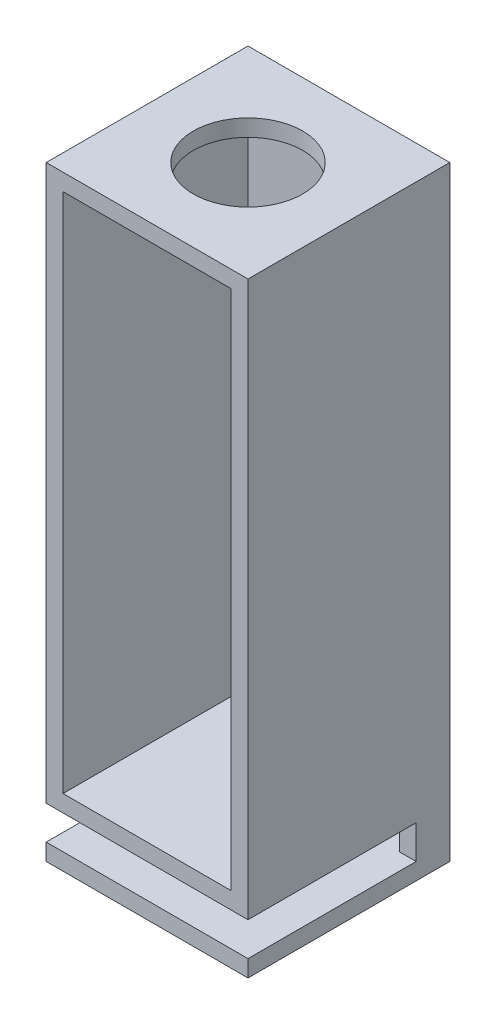
ISO-10303-21;
HEADER;
FILE_DESCRIPTION(('STEP AP214'),'2;1');
FILE_NAME('part.step','',(''),(''),'','','');
FILE_SCHEMA(('AUTOMOTIVE_DESIGN { 1 0 10303 214 1 1 1 1 }'));
ENDSEC;
DATA;
#1=APPLICATION_CONTEXT('core data for automotive mechanical design processes');
#2=APPLICATION_PROTOCOL_DEFINITION('international standard','automotive_design',2000,#1);
#3=PRODUCT_CONTEXT('',#1,'mechanical');
#4=PRODUCT('Part','Part','',(#3));
#5=PRODUCT_RELATED_PRODUCT_CATEGORY('part','',(#4));
#6=PRODUCT_DEFINITION_FORMATION('','',#4);
#7=PRODUCT_DEFINITION_CONTEXT('part definition',#1,'design');
#8=PRODUCT_DEFINITION('design','',#6,#7);
#9=PRODUCT_DEFINITION_SHAPE('','',#8);
#10=(LENGTH_UNIT() NAMED_UNIT(*) SI_UNIT(.MILLI.,.METRE.));
#11=(NAMED_UNIT(*) PLANE_ANGLE_UNIT() SI_UNIT($,.RADIAN.));
#12=(NAMED_UNIT(*) SI_UNIT($,.STERADIAN.) SOLID_ANGLE_UNIT());
#13=UNCERTAINTY_MEASURE_WITH_UNIT(LENGTH_MEASURE(1.E-05),#10,'distance_accuracy_value','');
#14=(GEOMETRIC_REPRESENTATION_CONTEXT(3) GLOBAL_UNCERTAINTY_ASSIGNED_CONTEXT((#13)) GLOBAL_UNIT_ASSIGNED_CONTEXT((#10,
#11,#12)) REPRESENTATION_CONTEXT('',''));
#15=CARTESIAN_POINT('',(0.,0.,0.));
#16=DIRECTION('',(0.,0.,1.));
#17=DIRECTION('',(1.,0.,0.));
#18=AXIS2_PLACEMENT_3D('',#15,#16,#17);
#19=CARTESIAN_POINT('',(5.,36.,-6.));
#20=DIRECTION('',(-1.,0.,0.));
#21=DIRECTION('',(0.,0.,1.));
#22=AXIS2_PLACEMENT_3D('',#19,#20,#21);
#23=PLANE('',#22);
#24=DIRECTION('',(0.,0.,1.));
#25=VECTOR('',#24,1.);
#26=CARTESIAN_POINT('',(5.,4.,-15.0498756211209));
#27=LINE('',#26,#25);
#28=CARTESIAN_POINT('',(5.,4.,-5.));
#29=VERTEX_POINT('',#28);
#30=CARTESIAN_POINT('',(5.,4.,6.));
#31=VERTEX_POINT('',#30);
#32=EDGE_CURVE('E158',#29,#31,#27,.T.);
#33=ORIENTED_EDGE('',*,*,#32,.T.);
#34=DIRECTION('',(0.,-1.,0.));
#35=VECTOR('',#34,1.);
#36=CARTESIAN_POINT('',(5.,36.,6.));
#37=LINE('',#36,#35);
#38=CARTESIAN_POINT('',(5.,35.,6.));
#39=VERTEX_POINT('',#38);
#40=EDGE_CURVE('E172',#39,#31,#37,.T.);
#41=ORIENTED_EDGE('',*,*,#40,.F.);
#42=DIRECTION('',(0.,0.,-1.));
#43=VECTOR('',#42,1.);
#44=CARTESIAN_POINT('',(5.,35.,-6.));
#45=LINE('',#44,#43);
#46=CARTESIAN_POINT('',(5.,35.,-5.));
#47=VERTEX_POINT('',#46);
#48=EDGE_CURVE('E197',#39,#47,#45,.T.);
#49=ORIENTED_EDGE('',*,*,#48,.T.);
#50=DIRECTION('',(0.,-1.,0.));
#51=VECTOR('',#50,1.);
#52=CARTESIAN_POINT('',(5.,36.,-5.));
#53=LINE('',#52,#51);
#54=EDGE_CURVE('E175',#47,#29,#53,.T.);
#55=ORIENTED_EDGE('',*,*,#54,.T.);
#56=EDGE_LOOP('',(#33,#41,#49,#55));
#57=FACE_BOUND('',#56,.T.);
#58=ADVANCED_FACE('F39',(#57),#23,.T.);
#59=CARTESIAN_POINT('',(-6.,36.,-5.));
#60=DIRECTION('',(0.,0.,1.));
#61=DIRECTION('',(1.,0.,0.));
#62=AXIS2_PLACEMENT_3D('',#59,#60,#61);
#63=PLANE('',#62);
#64=DIRECTION('',(1.,0.,0.));
#65=VECTOR('',#64,1.);
#66=CARTESIAN_POINT('',(-5.,4.,-5.));
#67=LINE('',#66,#65);
#68=CARTESIAN_POINT('',(-5.,4.,-5.));
#69=VERTEX_POINT('',#68);
#70=EDGE_CURVE('E300',#69,#29,#67,.T.);
#71=ORIENTED_EDGE('',*,*,#70,.T.);
#72=ORIENTED_EDGE('',*,*,#54,.F.);
#73=DIRECTION('',(-1.,0.,0.));
#74=VECTOR('',#73,1.);
#75=CARTESIAN_POINT('',(-6.,35.,-5.));
#76=LINE('',#75,#74);
#77=CARTESIAN_POINT('',(-5.,35.,-5.));
#78=VERTEX_POINT('',#77);
#79=EDGE_CURVE('E277',#47,#78,#76,.T.);
#80=ORIENTED_EDGE('',*,*,#79,.T.);
#81=DIRECTION('',(0.,-1.,0.));
#82=VECTOR('',#81,1.);
#83=CARTESIAN_POINT('',(-5.,36.,-5.));
#84=LINE('',#83,#82);
#85=EDGE_CURVE('E264',#78,#69,#84,.T.);
#86=ORIENTED_EDGE('',*,*,#85,.T.);
#87=EDGE_LOOP('',(#71,#72,#80,#86));
#88=FACE_BOUND('',#87,.T.);
#89=ADVANCED_FACE('F298',(#88),#63,.T.);
#90=CARTESIAN_POINT('',(-5.,36.,-6.));
#91=DIRECTION('',(1.,0.,0.));
#92=DIRECTION('',(0.,0.,-1.));
#93=AXIS2_PLACEMENT_3D('',#90,#91,#92);
#94=PLANE('',#93);
#95=DIRECTION('',(0.,0.,1.));
#96=VECTOR('',#95,1.);
#97=CARTESIAN_POINT('',(-5.,4.,-15.0498756211209));
#98=LINE('',#97,#96);
#99=CARTESIAN_POINT('',(-5.,4.,6.));
#100=VERTEX_POINT('',#99);
#101=EDGE_CURVE('E161',#69,#100,#98,.T.);
#102=ORIENTED_EDGE('',*,*,#101,.F.);
#103=ORIENTED_EDGE('',*,*,#85,.F.);
#104=DIRECTION('',(0.,0.,1.));
#105=VECTOR('',#104,1.);
#106=CARTESIAN_POINT('',(-5.,35.,-6.));
#107=LINE('',#106,#105);
#108=CARTESIAN_POINT('',(-5.,35.,6.));
#109=VERTEX_POINT('',#108);
#110=EDGE_CURVE('E189',#78,#109,#107,.T.);
#111=ORIENTED_EDGE('',*,*,#110,.T.);
#112=DIRECTION('',(0.,-1.,0.));
#113=VECTOR('',#112,1.);
#114=CARTESIAN_POINT('',(-5.,36.,6.));
#115=LINE('',#114,#113);
#116=EDGE_CURVE('E183',#109,#100,#115,.T.);
#117=ORIENTED_EDGE('',*,*,#116,.T.);
#118=EDGE_LOOP('',(#102,#103,#111,#117));
#119=FACE_BOUND('',#118,.T.);
#120=ADVANCED_FACE('F371',(#119),#94,.T.);
#121=CARTESIAN_POINT('',(-6.,36.,6.));
#122=DIRECTION('',(0.,0.,-1.));
#123=DIRECTION('',(-1.,0.,0.));
#124=AXIS2_PLACEMENT_3D('',#121,#122,#123);
#125=PLANE('',#124);
#126=ORIENTED_EDGE('',*,*,#40,.T.);
#127=DIRECTION('',(-1.,0.,0.));
#128=VECTOR('',#127,1.);
#129=CARTESIAN_POINT('',(-5.,4.,6.));
#130=LINE('',#129,#128);
#131=EDGE_CURVE('E155',#31,#100,#130,.T.);
#132=ORIENTED_EDGE('',*,*,#131,.T.);
#133=ORIENTED_EDGE('',*,*,#116,.F.);
#134=DIRECTION('',(1.,0.,0.));
#135=VECTOR('',#134,1.);
#136=CARTESIAN_POINT('',(-6.,35.,6.));
#137=LINE('',#136,#135);
#138=EDGE_CURVE('E181',#109,#39,#137,.T.);
#139=ORIENTED_EDGE('',*,*,#138,.T.);
#140=EDGE_LOOP('',(#126,#132,#133,#139));
#141=FACE_BOUND('',#140,.T.);
#142=DIRECTION('',(0.,-1.,0.));
#143=VECTOR('',#142,1.);
#144=CARTESIAN_POINT('',(-6.,36.,6.));
#145=LINE('',#144,#143);
#146=CARTESIAN_POINT('',(-6.,36.,6.));
#147=VERTEX_POINT('',#146);
#148=CARTESIAN_POINT('',(-6.,3.,6.));
#149=VERTEX_POINT('',#148);
#150=EDGE_CURVE('E233',#147,#149,#145,.T.);
#151=ORIENTED_EDGE('',*,*,#150,.T.);
#152=DIRECTION('',(-1.,0.,0.));
#153=VECTOR('',#152,1.);
#154=CARTESIAN_POINT('',(-6.77267637178051,3.,6.));
#155=LINE('',#154,#153);
#156=CARTESIAN_POINT('',(5.99999999999999,3.,6.));
#157=VERTEX_POINT('',#156);
#158=EDGE_CURVE('E306',#157,#149,#155,.T.);
#159=ORIENTED_EDGE('',*,*,#158,.F.);
#160=DIRECTION('',(0.,-1.,0.));
#161=VECTOR('',#160,1.);
#162=CARTESIAN_POINT('',(6.,36.,6.));
#163=LINE('',#162,#161);
#164=CARTESIAN_POINT('',(6.,36.,6.));
#165=VERTEX_POINT('',#164);
#166=EDGE_CURVE('E228',#165,#157,#163,.T.);
#167=ORIENTED_EDGE('',*,*,#166,.F.);
#168=DIRECTION('',(1.,0.,0.));
#169=VECTOR('',#168,1.);
#170=CARTESIAN_POINT('',(-6.,36.,6.));
#171=LINE('',#170,#169);
#172=EDGE_CURVE('E210',#147,#165,#171,.T.);
#173=ORIENTED_EDGE('',*,*,#172,.F.);
#174=EDGE_LOOP('',(#151,#159,#167,#173));
#175=FACE_BOUND('',#174,.T.);
#176=ADVANCED_FACE('F179',(#141,#175),#125,.F.);
#177=CARTESIAN_POINT('',(5.99999999999999,1.,6.));
#178=VERTEX_POINT('',#177);
#179=CARTESIAN_POINT('',(6.,0.,6.));
#180=VERTEX_POINT('',#179);
#181=EDGE_CURVE('E213',#178,#180,#163,.T.);
#182=ORIENTED_EDGE('',*,*,#181,.F.);
#183=DIRECTION('',(1.,0.,0.));
#184=VECTOR('',#183,1.);
#185=CARTESIAN_POINT('',(-6.,1.,6.));
#186=LINE('',#185,#184);
#187=CARTESIAN_POINT('',(-6.,1.,6.));
#188=VERTEX_POINT('',#187);
#189=EDGE_CURVE('E194',#188,#178,#186,.T.);
#190=ORIENTED_EDGE('',*,*,#189,.F.);
#191=CARTESIAN_POINT('',(-6.,0.,6.));
#192=VERTEX_POINT('',#191);
#193=EDGE_CURVE('E232',#188,#192,#145,.T.);
#194=ORIENTED_EDGE('',*,*,#193,.T.);
#195=DIRECTION('',(1.,0.,0.));
#196=VECTOR('',#195,1.);
#197=CARTESIAN_POINT('',(-6.,0.,6.));
#198=LINE('',#197,#196);
#199=EDGE_CURVE('E204',#192,#180,#198,.T.);
#200=ORIENTED_EDGE('',*,*,#199,.T.);
#201=EDGE_LOOP('',(#182,#190,#194,#200));
#202=FACE_BOUND('',#201,.T.);
#203=ADVANCED_FACE('F254',(#202),#125,.F.);
#204=CARTESIAN_POINT('',(6.,36.,-6.));
#205=DIRECTION('',(-1.,0.,0.));
#206=DIRECTION('',(0.,0.,1.));
#207=AXIS2_PLACEMENT_3D('',#204,#205,#206);
#208=PLANE('',#207);
#209=ORIENTED_EDGE('',*,*,#166,.T.);
#210=DIRECTION('',(0.,0.,-1.));
#211=VECTOR('',#210,1.);
#212=CARTESIAN_POINT('',(6.,3.,-6.));
#213=LINE('',#212,#211);
#214=CARTESIAN_POINT('',(5.99999999999999,3.,-4.));
#215=VERTEX_POINT('',#214);
#216=EDGE_CURVE('E348',#157,#215,#213,.T.);
#217=ORIENTED_EDGE('',*,*,#216,.T.);
#218=DIRECTION('',(0.,-1.,0.));
#219=VECTOR('',#218,1.);
#220=CARTESIAN_POINT('',(6.,36.,-4.));
#221=LINE('',#220,#219);
#222=CARTESIAN_POINT('',(5.99999999999999,1.,-4.));
#223=VERTEX_POINT('',#222);
#224=EDGE_CURVE('E334',#215,#223,#221,.T.);
#225=ORIENTED_EDGE('',*,*,#224,.T.);
#226=DIRECTION('',(0.,0.,1.));
#227=VECTOR('',#226,1.);
#228=CARTESIAN_POINT('',(6.,1.,-6.));
#229=LINE('',#228,#227);
#230=EDGE_CURVE('E341',#223,#178,#229,.T.);
#231=ORIENTED_EDGE('',*,*,#230,.T.);
#232=ORIENTED_EDGE('',*,*,#181,.T.);
#233=DIRECTION('',(0.,0.,-1.));
#234=VECTOR('',#233,1.);
#235=CARTESIAN_POINT('',(6.,0.,-6.));
#236=LINE('',#235,#234);
#237=CARTESIAN_POINT('',(6.,0.,-6.));
#238=VERTEX_POINT('',#237);
#239=EDGE_CURVE('E214',#180,#238,#236,.T.);
#240=ORIENTED_EDGE('',*,*,#239,.T.);
#241=DIRECTION('',(0.,-1.,0.));
#242=VECTOR('',#241,1.);
#243=CARTESIAN_POINT('',(6.,36.,-6.));
#244=LINE('',#243,#242);
#245=CARTESIAN_POINT('',(6.,36.,-6.));
#246=VERTEX_POINT('',#245);
#247=EDGE_CURVE('E11',#246,#238,#244,.T.);
#248=ORIENTED_EDGE('',*,*,#247,.F.);
#249=DIRECTION('',(0.,0.,-1.));
#250=VECTOR('',#249,1.);
#251=CARTESIAN_POINT('',(6.,36.,-6.));
#252=LINE('',#251,#250);
#253=EDGE_CURVE('E199',#165,#246,#252,.T.);
#254=ORIENTED_EDGE('',*,*,#253,.F.);
#255=EDGE_LOOP('',(#209,#217,#225,#231,#232,#240,#248,#254));
#256=FACE_BOUND('',#255,.T.);
#257=ADVANCED_FACE('F41',(#256),#208,.F.);
#258=CARTESIAN_POINT('',(-6.,36.,-6.));
#259=DIRECTION('',(0.,0.,1.));
#260=DIRECTION('',(1.,0.,0.));
#261=AXIS2_PLACEMENT_3D('',#258,#259,#260);
#262=PLANE('',#261);
#263=DIRECTION('',(-1.,0.,0.));
#264=VECTOR('',#263,1.);
#265=CARTESIAN_POINT('',(-6.,0.,-6.));
#266=LINE('',#265,#264);
#267=CARTESIAN_POINT('',(-6.,0.,-6.));
#268=VERTEX_POINT('',#267);
#269=EDGE_CURVE('E218',#238,#268,#266,.T.);
#270=ORIENTED_EDGE('',*,*,#269,.T.);
#271=DIRECTION('',(0.,-1.,0.));
#272=VECTOR('',#271,1.);
#273=CARTESIAN_POINT('',(-6.,36.,-6.));
#274=LINE('',#273,#272);
#275=CARTESIAN_POINT('',(-6.,36.,-6.));
#276=VERTEX_POINT('',#275);
#277=EDGE_CURVE('E49',#276,#268,#274,.T.);
#278=ORIENTED_EDGE('',*,*,#277,.F.);
#279=DIRECTION('',(-1.,0.,0.));
#280=VECTOR('',#279,1.);
#281=CARTESIAN_POINT('',(-6.,36.,-6.));
#282=LINE('',#281,#280);
#283=EDGE_CURVE('E203',#246,#276,#282,.T.);
#284=ORIENTED_EDGE('',*,*,#283,.F.);
#285=ORIENTED_EDGE('',*,*,#247,.T.);
#286=EDGE_LOOP('',(#270,#278,#284,#285));
#287=FACE_BOUND('',#286,.T.);
#288=ADVANCED_FACE('F399',(#287),#262,.F.);
#289=CARTESIAN_POINT('',(-6.,36.,-6.));
#290=DIRECTION('',(1.,0.,0.));
#291=DIRECTION('',(0.,0.,-1.));
#292=AXIS2_PLACEMENT_3D('',#289,#290,#291);
#293=PLANE('',#292);
#294=DIRECTION('',(0.,1.,0.));
#295=VECTOR('',#294,1.);
#296=CARTESIAN_POINT('',(-6.,36.,-4.));
#297=LINE('',#296,#295);
#298=CARTESIAN_POINT('',(-6.,1.,-4.));
#299=VERTEX_POINT('',#298);
#300=CARTESIAN_POINT('',(-6.,3.,-4.));
#301=VERTEX_POINT('',#300);
#302=EDGE_CURVE('E331',#299,#301,#297,.T.);
#303=ORIENTED_EDGE('',*,*,#302,.T.);
#304=DIRECTION('',(0.,0.,1.));
#305=VECTOR('',#304,1.);
#306=CARTESIAN_POINT('',(-6.,3.,-6.));
#307=LINE('',#306,#305);
#308=EDGE_CURVE('E345',#301,#149,#307,.T.);
#309=ORIENTED_EDGE('',*,*,#308,.T.);
#310=ORIENTED_EDGE('',*,*,#150,.F.);
#311=DIRECTION('',(0.,0.,1.));
#312=VECTOR('',#311,1.);
#313=CARTESIAN_POINT('',(-6.,36.,-6.));
#314=LINE('',#313,#312);
#315=EDGE_CURVE('E207',#276,#147,#314,.T.);
#316=ORIENTED_EDGE('',*,*,#315,.F.);
#317=ORIENTED_EDGE('',*,*,#277,.T.);
#318=DIRECTION('',(0.,0.,1.));
#319=VECTOR('',#318,1.);
#320=CARTESIAN_POINT('',(-6.,0.,-6.));
#321=LINE('',#320,#319);
#322=EDGE_CURVE('E221',#268,#192,#321,.T.);
#323=ORIENTED_EDGE('',*,*,#322,.T.);
#324=ORIENTED_EDGE('',*,*,#193,.F.);
#325=DIRECTION('',(0.,0.,-1.));
#326=VECTOR('',#325,1.);
#327=CARTESIAN_POINT('',(-6.,1.,-6.));
#328=LINE('',#327,#326);
#329=EDGE_CURVE('E338',#188,#299,#328,.T.);
#330=ORIENTED_EDGE('',*,*,#329,.T.);
#331=EDGE_LOOP('',(#303,#309,#310,#316,#317,#323,#324,#330));
#332=FACE_BOUND('',#331,.T.);
#333=ADVANCED_FACE('F244',(#332),#293,.F.);
#334=CARTESIAN_POINT('',(0.,36.,0.));
#335=DIRECTION('',(0.,1.,0.));
#336=DIRECTION('',(0.,0.,1.));
#337=AXIS2_PLACEMENT_3D('',#334,#335,#336);
#338=PLANE('',#337);
#339=CARTESIAN_POINT('',(0.,36.,0.));
#340=DIRECTION('',(0.,1.,0.));
#341=DIRECTION('',(0.,0.,1.));
#342=AXIS2_PLACEMENT_3D('',#339,#340,#341);
#343=CIRCLE('',#342,3.25);
#344=CARTESIAN_POINT('',(0.,36.,-3.25));
#345=VERTEX_POINT('',#344);
#346=EDGE_CURVE('E287',#345,#345,#343,.F.);
#347=ORIENTED_EDGE('',*,*,#346,.T.);
#348=EDGE_LOOP('',(#347));
#349=FACE_BOUND('',#348,.T.);
#350=ORIENTED_EDGE('',*,*,#253,.T.);
#351=ORIENTED_EDGE('',*,*,#283,.T.);
#352=ORIENTED_EDGE('',*,*,#315,.T.);
#353=ORIENTED_EDGE('',*,*,#172,.T.);
#354=EDGE_LOOP('',(#350,#351,#352,#353));
#355=FACE_BOUND('',#354,.T.);
#356=ADVANCED_FACE('F386',(#349,#355),#338,.T.);
#357=CARTESIAN_POINT('',(0.,0.,0.));
#358=DIRECTION('',(0.,1.,0.));
#359=DIRECTION('',(0.,0.,1.));
#360=AXIS2_PLACEMENT_3D('',#357,#358,#359);
#361=PLANE('',#360);
#362=ORIENTED_EDGE('',*,*,#239,.F.);
#363=ORIENTED_EDGE('',*,*,#199,.F.);
#364=ORIENTED_EDGE('',*,*,#322,.F.);
#365=ORIENTED_EDGE('',*,*,#269,.F.);
#366=EDGE_LOOP('',(#362,#363,#364,#365));
#367=FACE_BOUND('',#366,.T.);
#368=ADVANCED_FACE('F251',(#367),#361,.F.);
#369=DIRECTION('',(0.,0.,1.));
#370=VECTOR('',#369,1.);
#371=CARTESIAN_POINT('',(5.,3.,-15.0498756211209));
#372=LINE('',#371,#370);
#373=CARTESIAN_POINT('',(5.,3.,-5.));
#374=VERTEX_POINT('',#373);
#375=CARTESIAN_POINT('',(5.,3.,-4.));
#376=VERTEX_POINT('',#375);
#377=EDGE_CURVE('E56',#374,#376,#372,.T.);
#378=ORIENTED_EDGE('',*,*,#377,.F.);
#379=CARTESIAN_POINT('',(5.,1.,-5.));
#380=VERTEX_POINT('',#379);
#381=EDGE_CURVE('E261',#374,#380,#53,.T.);
#382=ORIENTED_EDGE('',*,*,#381,.T.);
#383=DIRECTION('',(0.,0.,-1.));
#384=VECTOR('',#383,1.);
#385=CARTESIAN_POINT('',(5.,1.,-6.));
#386=LINE('',#385,#384);
#387=CARTESIAN_POINT('',(5.,1.,-4.));
#388=VERTEX_POINT('',#387);
#389=EDGE_CURVE('E284',#388,#380,#386,.T.);
#390=ORIENTED_EDGE('',*,*,#389,.F.);
#391=DIRECTION('',(0.,-1.,0.));
#392=VECTOR('',#391,1.);
#393=CARTESIAN_POINT('',(5.,36.,-4.));
#394=LINE('',#393,#392);
#395=EDGE_CURVE('E328',#376,#388,#394,.T.);
#396=ORIENTED_EDGE('',*,*,#395,.F.);
#397=EDGE_LOOP('',(#378,#382,#390,#396));
#398=FACE_BOUND('',#397,.T.);
#399=ADVANCED_FACE('F374',(#398),#23,.T.);
#400=DIRECTION('',(-1.,0.,0.));
#401=VECTOR('',#400,1.);
#402=CARTESIAN_POINT('',(-5.,3.,-5.));
#403=LINE('',#402,#401);
#404=CARTESIAN_POINT('',(-5.,3.,-5.));
#405=VERTEX_POINT('',#404);
#406=EDGE_CURVE('E302',#374,#405,#403,.T.);
#407=ORIENTED_EDGE('',*,*,#406,.T.);
#408=CARTESIAN_POINT('',(-5.,1.,-5.));
#409=VERTEX_POINT('',#408);
#410=EDGE_CURVE('E187',#405,#409,#84,.T.);
#411=ORIENTED_EDGE('',*,*,#410,.T.);
#412=DIRECTION('',(-1.,0.,0.));
#413=VECTOR('',#412,1.);
#414=CARTESIAN_POINT('',(-6.,1.,-5.));
#415=LINE('',#414,#413);
#416=EDGE_CURVE('E275',#380,#409,#415,.T.);
#417=ORIENTED_EDGE('',*,*,#416,.F.);
#418=ORIENTED_EDGE('',*,*,#381,.F.);
#419=EDGE_LOOP('',(#407,#411,#417,#418));
#420=FACE_BOUND('',#419,.T.);
#421=ADVANCED_FACE('F368',(#420),#63,.T.);
#422=DIRECTION('',(0.,0.,1.));
#423=VECTOR('',#422,1.);
#424=CARTESIAN_POINT('',(-5.,3.,-15.0498756211209));
#425=LINE('',#424,#423);
#426=CARTESIAN_POINT('',(-5.,3.,-4.));
#427=VERTEX_POINT('',#426);
#428=EDGE_CURVE('E167',#405,#427,#425,.T.);
#429=ORIENTED_EDGE('',*,*,#428,.T.);
#430=DIRECTION('',(0.,1.,0.));
#431=VECTOR('',#430,1.);
#432=CARTESIAN_POINT('',(-5.,36.,-4.));
#433=LINE('',#432,#431);
#434=CARTESIAN_POINT('',(-5.,1.,-4.));
#435=VERTEX_POINT('',#434);
#436=EDGE_CURVE('E325',#435,#427,#433,.T.);
#437=ORIENTED_EDGE('',*,*,#436,.F.);
#438=DIRECTION('',(0.,0.,1.));
#439=VECTOR('',#438,1.);
#440=CARTESIAN_POINT('',(-5.,1.,-6.));
#441=LINE('',#440,#439);
#442=EDGE_CURVE('E198',#409,#435,#441,.T.);
#443=ORIENTED_EDGE('',*,*,#442,.F.);
#444=ORIENTED_EDGE('',*,*,#410,.F.);
#445=EDGE_LOOP('',(#429,#437,#443,#444));
#446=FACE_BOUND('',#445,.T.);
#447=ADVANCED_FACE('F361',(#446),#94,.T.);
#448=CARTESIAN_POINT('',(0.,35.,0.));
#449=DIRECTION('',(0.,1.,0.));
#450=DIRECTION('',(0.,0.,1.));
#451=AXIS2_PLACEMENT_3D('',#448,#449,#450);
#452=PLANE('',#451);
#453=CARTESIAN_POINT('',(0.,35.,0.));
#454=DIRECTION('',(0.,1.,0.));
#455=DIRECTION('',(0.,0.,1.));
#456=AXIS2_PLACEMENT_3D('',#453,#454,#455);
#457=CIRCLE('',#456,3.25);
#458=CARTESIAN_POINT('',(0.,35.,-3.25));
#459=VERTEX_POINT('',#458);
#460=EDGE_CURVE('E43',#459,#459,#457,.F.);
#461=ORIENTED_EDGE('',*,*,#460,.F.);
#462=EDGE_LOOP('',(#461));
#463=FACE_BOUND('',#462,.T.);
#464=ORIENTED_EDGE('',*,*,#48,.F.);
#465=ORIENTED_EDGE('',*,*,#138,.F.);
#466=ORIENTED_EDGE('',*,*,#110,.F.);
#467=ORIENTED_EDGE('',*,*,#79,.F.);
#468=EDGE_LOOP('',(#464,#465,#466,#467));
#469=FACE_BOUND('',#468,.T.);
#470=ADVANCED_FACE('F358',(#463,#469),#452,.F.);
#471=CARTESIAN_POINT('',(0.,1.,0.));
#472=DIRECTION('',(0.,1.,0.));
#473=DIRECTION('',(0.,0.,1.));
#474=AXIS2_PLACEMENT_3D('',#471,#472,#473);
#475=PLANE('',#474);
#476=ORIENTED_EDGE('',*,*,#442,.T.);
#477=DIRECTION('',(1.,0.,0.));
#478=VECTOR('',#477,1.);
#479=CARTESIAN_POINT('',(-6.77267637178051,1.,-4.));
#480=LINE('',#479,#478);
#481=EDGE_CURVE('E64',#299,#435,#480,.T.);
#482=ORIENTED_EDGE('',*,*,#481,.F.);
#483=ORIENTED_EDGE('',*,*,#329,.F.);
#484=ORIENTED_EDGE('',*,*,#189,.T.);
#485=ORIENTED_EDGE('',*,*,#230,.F.);
#486=EDGE_CURVE('E314',#388,#223,#480,.T.);
#487=ORIENTED_EDGE('',*,*,#486,.F.);
#488=ORIENTED_EDGE('',*,*,#389,.T.);
#489=ORIENTED_EDGE('',*,*,#416,.T.);
#490=EDGE_LOOP('',(#476,#482,#483,#484,#485,#487,#488,#489));
#491=FACE_BOUND('',#490,.T.);
#492=ADVANCED_FACE('F360',(#491),#475,.T.);
#493=CARTESIAN_POINT('',(0.,36.000012,0.));
#494=DIRECTION('',(0.,-1.,0.));
#495=DIRECTION('',(0.,0.,-1.));
#496=AXIS2_PLACEMENT_3D('',#493,#494,#495);
#497=CYLINDRICAL_SURFACE('',#496,3.25);
#498=CARTESIAN_POINT('',(0.,36.,-3.25));
#499=CARTESIAN_POINT('',(0.,35.9895833333333,-3.25));
#500=CARTESIAN_POINT('',(0.,35.9791666666667,-3.25));
#501=CARTESIAN_POINT('',(0.,35.9583333333333,-3.25));
#502=CARTESIAN_POINT('',(0.,35.9479166666667,-3.25));
#503=CARTESIAN_POINT('',(0.,35.9270833333333,-3.25));
#504=CARTESIAN_POINT('',(0.,35.9166666666667,-3.25));
#505=CARTESIAN_POINT('',(0.,35.8958333333333,-3.25));
#506=CARTESIAN_POINT('',(0.,35.8854166666667,-3.25));
#507=CARTESIAN_POINT('',(0.,35.8645833333333,-3.25));
#508=CARTESIAN_POINT('',(0.,35.8541666666667,-3.25));
#509=CARTESIAN_POINT('',(0.,35.8333333333333,-3.25));
#510=CARTESIAN_POINT('',(0.,35.8229166666667,-3.25));
#511=CARTESIAN_POINT('',(0.,35.8020833333333,-3.25));
#512=CARTESIAN_POINT('',(0.,35.7916666666667,-3.25));
#513=CARTESIAN_POINT('',(0.,35.7708333333333,-3.25));
#514=CARTESIAN_POINT('',(0.,35.7604166666667,-3.25));
#515=CARTESIAN_POINT('',(0.,35.7395833333333,-3.25));
#516=CARTESIAN_POINT('',(0.,35.7291666666667,-3.25));
#517=CARTESIAN_POINT('',(0.,35.7083333333333,-3.25));
#518=CARTESIAN_POINT('',(0.,35.6979166666667,-3.25));
#519=CARTESIAN_POINT('',(0.,35.6770833333333,-3.25));
#520=CARTESIAN_POINT('',(0.,35.6666666666667,-3.25));
#521=CARTESIAN_POINT('',(0.,35.6458333333333,-3.25));
#522=CARTESIAN_POINT('',(0.,35.6354166666667,-3.25));
#523=CARTESIAN_POINT('',(0.,35.6145833333333,-3.25));
#524=CARTESIAN_POINT('',(0.,35.6041666666667,-3.25));
#525=CARTESIAN_POINT('',(0.,35.5833333333333,-3.25));
#526=CARTESIAN_POINT('',(0.,35.5729166666667,-3.25));
#527=CARTESIAN_POINT('',(0.,35.5520833333333,-3.25));
#528=CARTESIAN_POINT('',(0.,35.5416666666667,-3.25));
#529=CARTESIAN_POINT('',(0.,35.5208333333333,-3.25));
#530=CARTESIAN_POINT('',(0.,35.5104166666667,-3.25));
#531=CARTESIAN_POINT('',(0.,35.4895833333333,-3.25));
#532=CARTESIAN_POINT('',(0.,35.4791666666667,-3.25));
#533=CARTESIAN_POINT('',(0.,35.4583333333333,-3.25));
#534=CARTESIAN_POINT('',(0.,35.4479166666667,-3.25));
#535=CARTESIAN_POINT('',(0.,35.4270833333333,-3.25));
#536=CARTESIAN_POINT('',(0.,35.4166666666667,-3.25));
#537=CARTESIAN_POINT('',(0.,35.3958333333333,-3.25));
#538=CARTESIAN_POINT('',(0.,35.3854166666667,-3.25));
#539=CARTESIAN_POINT('',(0.,35.3645833333333,-3.25));
#540=CARTESIAN_POINT('',(0.,35.3541666666667,-3.25));
#541=CARTESIAN_POINT('',(0.,35.3333333333333,-3.25));
#542=CARTESIAN_POINT('',(0.,35.3229166666667,-3.25));
#543=CARTESIAN_POINT('',(0.,35.3020833333333,-3.25));
#544=CARTESIAN_POINT('',(0.,35.2916666666667,-3.25));
#545=CARTESIAN_POINT('',(0.,35.2708333333333,-3.25));
#546=CARTESIAN_POINT('',(0.,35.2604166666667,-3.25));
#547=CARTESIAN_POINT('',(0.,35.2395833333333,-3.25));
#548=CARTESIAN_POINT('',(0.,35.2291666666667,-3.25));
#549=CARTESIAN_POINT('',(0.,35.2083333333333,-3.25));
#550=CARTESIAN_POINT('',(0.,35.1979166666667,-3.25));
#551=CARTESIAN_POINT('',(0.,35.1770833333333,-3.25));
#552=CARTESIAN_POINT('',(0.,35.1666666666667,-3.25));
#553=CARTESIAN_POINT('',(0.,35.1458333333333,-3.25));
#554=CARTESIAN_POINT('',(0.,35.1354166666667,-3.25));
#555=CARTESIAN_POINT('',(0.,35.1145833333333,-3.25));
#556=CARTESIAN_POINT('',(0.,35.1041666666667,-3.25));
#557=CARTESIAN_POINT('',(0.,35.0833333333333,-3.25));
#558=CARTESIAN_POINT('',(0.,35.0729166666667,-3.25));
#559=CARTESIAN_POINT('',(0.,35.0520833333333,-3.25));
#560=CARTESIAN_POINT('',(0.,35.0416666666667,-3.25));
#561=CARTESIAN_POINT('',(0.,35.0208333333333,-3.25));
#562=CARTESIAN_POINT('',(0.,35.0104166666667,-3.25));
#563=CARTESIAN_POINT('',(0.,35.,-3.25));
#564=B_SPLINE_CURVE_WITH_KNOTS('',3,(#498,#499,#500,#501,#502,#503,#504,#505,#506,#507,#508,
#509,#510,#511,#512,#513,#514,#515,#516,#517,#518,#519,#520,#521,#522,#523,#524,#525,#526,#527,
#528,#529,#530,#531,#532,#533,#534,#535,#536,#537,#538,#539,#540,#541,#542,#543,#544,#545,#546,
#547,#548,#549,#550,#551,#552,#553,#554,#555,#556,#557,#558,#559,#560,#561,#562,#563),
.UNSPECIFIED.,.F.,.F.,(4,2,2,2,2,2,2,2,2,2,2,2,2,2,2,2,2,2,2,2,2,2,2,2,2,2,2,2,2,2,2,2,4),(0.,
0.0312500000000035,0.0625000000000001,0.0937500000000036,0.125,0.156250000000004,0.1875,
0.218750000000004,0.25,0.281250000000004,0.3125,0.343750000000004,0.375,0.406250000000004,
0.4375,0.468750000000004,0.5,0.531250000000004,0.5625,0.593750000000004,0.625000000000001,
0.656250000000004,0.687500000000001,0.718750000000004,0.750000000000001,0.781250000000004,
0.812500000000001,0.843750000000004,0.875000000000001,0.906250000000004,0.937500000000001,
0.968750000000004,1.),.UNSPECIFIED.);
#565=EDGE_CURVE('BSEAM356',#345,#459,#564,.T.);
#566=ORIENTED_EDGE('',*,*,#346,.F.);
#567=ORIENTED_EDGE('',*,*,#460,.T.);
#568=ORIENTED_EDGE('',*,*,#565,.T.);
#569=ORIENTED_EDGE('',*,*,#565,.F.);
#570=EDGE_LOOP('',(#566,#568,#567,#569));
#571=FACE_BOUND('',#570,.T.);
#572=ADVANCED_FACE('F356',(#571),#497,.F.);
#573=CARTESIAN_POINT('',(0.,0.,-4.));
#574=DIRECTION('',(0.,0.,-1.));
#575=DIRECTION('',(-1.,0.,0.));
#576=AXIS2_PLACEMENT_3D('',#573,#574,#575);
#577=PLANE('',#576);
#578=ORIENTED_EDGE('',*,*,#481,.T.);
#579=ORIENTED_EDGE('',*,*,#436,.T.);
#580=DIRECTION('',(-1.,0.,0.));
#581=VECTOR('',#580,1.);
#582=CARTESIAN_POINT('',(-6.77267637178051,3.,-4.));
#583=LINE('',#582,#581);
#584=EDGE_CURVE('E318',#427,#301,#583,.T.);
#585=ORIENTED_EDGE('',*,*,#584,.T.);
#586=ORIENTED_EDGE('',*,*,#302,.F.);
#587=EDGE_LOOP('',(#578,#579,#585,#586));
#588=FACE_BOUND('',#587,.T.);
#589=ADVANCED_FACE('F391',(#588),#577,.F.);
#590=CARTESIAN_POINT('',(-6.77267637178051,3.,-4.));
#591=DIRECTION('',(0.,1.,0.));
#592=DIRECTION('',(0.,0.,1.));
#593=AXIS2_PLACEMENT_3D('',#590,#591,#592);
#594=PLANE('',#593);
#595=ORIENTED_EDGE('',*,*,#158,.T.);
#596=ORIENTED_EDGE('',*,*,#308,.F.);
#597=ORIENTED_EDGE('',*,*,#584,.F.);
#598=ORIENTED_EDGE('',*,*,#428,.F.);
#599=ORIENTED_EDGE('',*,*,#406,.F.);
#600=ORIENTED_EDGE('',*,*,#377,.T.);
#601=EDGE_CURVE('E322',#215,#376,#583,.T.);
#602=ORIENTED_EDGE('',*,*,#601,.F.);
#603=ORIENTED_EDGE('',*,*,#216,.F.);
#604=EDGE_LOOP('',(#595,#596,#597,#598,#599,#600,#602,#603));
#605=FACE_BOUND('',#604,.T.);
#606=ADVANCED_FACE('F392',(#605),#594,.F.);
#607=ORIENTED_EDGE('',*,*,#601,.T.);
#608=ORIENTED_EDGE('',*,*,#395,.T.);
#609=ORIENTED_EDGE('',*,*,#486,.T.);
#610=ORIENTED_EDGE('',*,*,#224,.F.);
#611=EDGE_LOOP('',(#607,#608,#609,#610));
#612=FACE_BOUND('',#611,.T.);
#613=ADVANCED_FACE('F401',(#612),#577,.F.);
#614=CARTESIAN_POINT('',(-5.,4.,-15.0498756211209));
#615=DIRECTION('',(0.,1.,0.));
#616=DIRECTION('',(0.,0.,1.));
#617=AXIS2_PLACEMENT_3D('',#614,#615,#616);
#618=PLANE('',#617);
#619=ORIENTED_EDGE('',*,*,#70,.F.);
#620=ORIENTED_EDGE('',*,*,#101,.T.);
#621=ORIENTED_EDGE('',*,*,#131,.F.);
#622=ORIENTED_EDGE('',*,*,#32,.F.);
#623=EDGE_LOOP('',(#619,#620,#621,#622));
#624=FACE_BOUND('',#623,.T.);
#625=ADVANCED_FACE('F157',(#624),#618,.T.);
#626=CLOSED_SHELL('',(#58,#89,#120,#176,#203,#257,#288,#333,#356,#368,#399,#421,#447,#470,#492,
#572,#589,#606,#613,#625));
#627=MANIFOLD_SOLID_BREP('B2',#626);
#628=ADVANCED_BREP_SHAPE_REPRESENTATION('',(#18,#627),#14);
#629=SHAPE_DEFINITION_REPRESENTATION(#9,#628);
ENDSEC;
END-ISO-10303-21;
